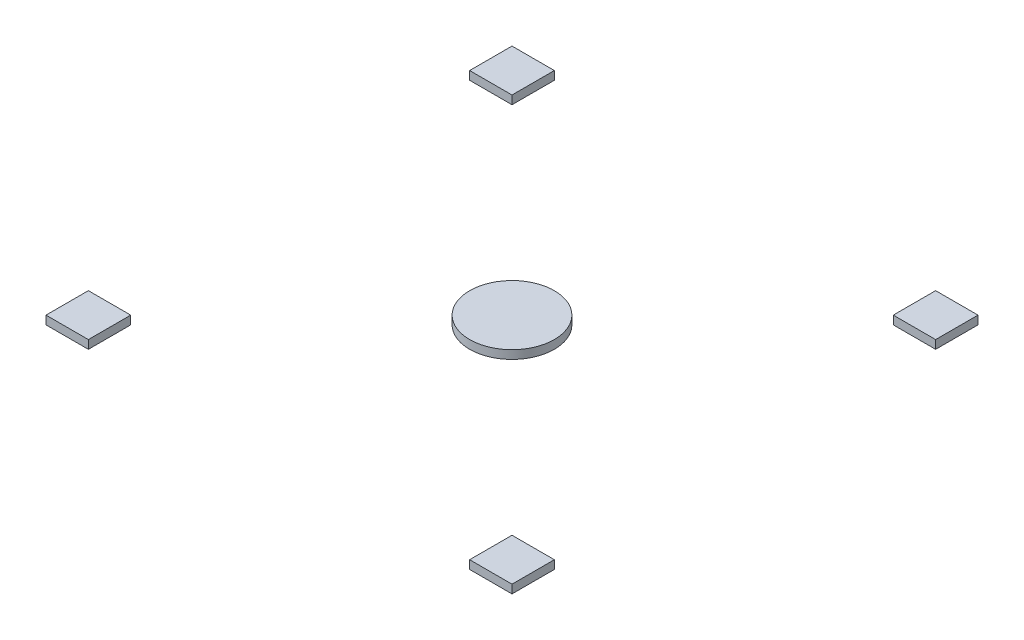
ISO-10303-21;
HEADER;
FILE_DESCRIPTION(('STEP AP214'),'2;1');
FILE_NAME('part.step','',(''),(''),'','','');
FILE_SCHEMA(('AUTOMOTIVE_DESIGN { 1 0 10303 214 1 1 1 1 }'));
ENDSEC;
DATA;
#1=APPLICATION_CONTEXT('core data for automotive mechanical design processes');
#2=APPLICATION_PROTOCOL_DEFINITION('international standard','automotive_design',2000,#1);
#3=PRODUCT_CONTEXT('',#1,'mechanical');
#4=PRODUCT('Part','Part','',(#3));
#5=PRODUCT_RELATED_PRODUCT_CATEGORY('part','',(#4));
#6=PRODUCT_DEFINITION_FORMATION('','',#4);
#7=PRODUCT_DEFINITION_CONTEXT('part definition',#1,'design');
#8=PRODUCT_DEFINITION('design','',#6,#7);
#9=PRODUCT_DEFINITION_SHAPE('','',#8);
#10=(LENGTH_UNIT() NAMED_UNIT(*) SI_UNIT(.MILLI.,.METRE.));
#11=(NAMED_UNIT(*) PLANE_ANGLE_UNIT() SI_UNIT($,.RADIAN.));
#12=(NAMED_UNIT(*) SI_UNIT($,.STERADIAN.) SOLID_ANGLE_UNIT());
#13=UNCERTAINTY_MEASURE_WITH_UNIT(LENGTH_MEASURE(1.E-05),#10,'distance_accuracy_value','');
#14=(GEOMETRIC_REPRESENTATION_CONTEXT(3) GLOBAL_UNCERTAINTY_ASSIGNED_CONTEXT((#13)) GLOBAL_UNIT_ASSIGNED_CONTEXT((#10,
#11,#12)) REPRESENTATION_CONTEXT('',''));
#15=CARTESIAN_POINT('',(0.,0.,0.));
#16=DIRECTION('',(0.,0.,1.));
#17=DIRECTION('',(1.,0.,0.));
#18=AXIS2_PLACEMENT_3D('',#15,#16,#17);
#19=CARTESIAN_POINT('',(-54.9999999999999,2.,55.));
#20=DIRECTION('',(0.,0.,-1.));
#21=DIRECTION('',(-1.,0.,0.));
#22=AXIS2_PLACEMENT_3D('',#19,#20,#21);
#23=PLANE('',#22);
#24=DIRECTION('',(1.,0.,0.));
#25=VECTOR('',#24,1.);
#26=CARTESIAN_POINT('',(-54.9999999999999,0.,55.));
#27=LINE('',#26,#25);
#28=CARTESIAN_POINT('',(-54.9999999999999,0.,55.));
#29=VERTEX_POINT('',#28);
#30=CARTESIAN_POINT('',(-44.9999999999999,0.,55.));
#31=VERTEX_POINT('',#30);
#32=EDGE_CURVE('E113',#29,#31,#27,.T.);
#33=ORIENTED_EDGE('',*,*,#32,.T.);
#34=DIRECTION('',(0.,-1.,0.));
#35=VECTOR('',#34,1.);
#36=CARTESIAN_POINT('',(-44.9999999999999,2.,55.));
#37=LINE('',#36,#35);
#38=CARTESIAN_POINT('',(-44.9999999999999,2.,55.));
#39=VERTEX_POINT('',#38);
#40=EDGE_CURVE('E12',#39,#31,#37,.T.);
#41=ORIENTED_EDGE('',*,*,#40,.F.);
#42=DIRECTION('',(1.,0.,0.));
#43=VECTOR('',#42,1.);
#44=CARTESIAN_POINT('',(-54.9999999999999,2.,55.));
#45=LINE('',#44,#43);
#46=CARTESIAN_POINT('',(-54.9999999999999,2.,55.));
#47=VERTEX_POINT('',#46);
#48=EDGE_CURVE('E101',#47,#39,#45,.T.);
#49=ORIENTED_EDGE('',*,*,#48,.F.);
#50=DIRECTION('',(0.,-1.,0.));
#51=VECTOR('',#50,1.);
#52=CARTESIAN_POINT('',(-54.9999999999999,2.,55.));
#53=LINE('',#52,#51);
#54=EDGE_CURVE('E109',#47,#29,#53,.T.);
#55=ORIENTED_EDGE('',*,*,#54,.T.);
#56=EDGE_LOOP('',(#33,#41,#49,#55));
#57=FACE_BOUND('',#56,.T.);
#58=ADVANCED_FACE('F50',(#57),#23,.F.);
#59=CARTESIAN_POINT('',(-44.9999999999999,2.,44.9999999999999));
#60=DIRECTION('',(-1.,0.,0.));
#61=DIRECTION('',(0.,0.,1.));
#62=AXIS2_PLACEMENT_3D('',#59,#60,#61);
#63=PLANE('',#62);
#64=DIRECTION('',(0.,0.,-1.));
#65=VECTOR('',#64,1.);
#66=CARTESIAN_POINT('',(-44.9999999999999,0.,44.9999999999999));
#67=LINE('',#66,#65);
#68=CARTESIAN_POINT('',(-44.9999999999999,0.,44.9999999999999));
#69=VERTEX_POINT('',#68);
#70=EDGE_CURVE('E105',#31,#69,#67,.T.);
#71=ORIENTED_EDGE('',*,*,#70,.T.);
#72=DIRECTION('',(0.,-1.,0.));
#73=VECTOR('',#72,1.);
#74=CARTESIAN_POINT('',(-44.9999999999999,2.,44.9999999999999));
#75=LINE('',#74,#73);
#76=CARTESIAN_POINT('',(-44.9999999999999,2.,44.9999999999999));
#77=VERTEX_POINT('',#76);
#78=EDGE_CURVE('E58',#77,#69,#75,.T.);
#79=ORIENTED_EDGE('',*,*,#78,.F.);
#80=DIRECTION('',(0.,0.,-1.));
#81=VECTOR('',#80,1.);
#82=CARTESIAN_POINT('',(-44.9999999999999,2.,44.9999999999999));
#83=LINE('',#82,#81);
#84=EDGE_CURVE('E96',#39,#77,#83,.T.);
#85=ORIENTED_EDGE('',*,*,#84,.F.);
#86=ORIENTED_EDGE('',*,*,#40,.T.);
#87=EDGE_LOOP('',(#71,#79,#85,#86));
#88=FACE_BOUND('',#87,.T.);
#89=ADVANCED_FACE('F104',(#88),#63,.F.);
#90=CARTESIAN_POINT('',(-54.9999999999999,2.,45.));
#91=DIRECTION('',(0.,0.,1.));
#92=DIRECTION('',(1.,0.,0.));
#93=AXIS2_PLACEMENT_3D('',#90,#91,#92);
#94=PLANE('',#93);
#95=DIRECTION('',(-1.,0.,0.));
#96=VECTOR('',#95,1.);
#97=CARTESIAN_POINT('',(-54.9999999999999,0.,45.));
#98=LINE('',#97,#96);
#99=CARTESIAN_POINT('',(-54.9999999999999,0.,45.));
#100=VERTEX_POINT('',#99);
#101=EDGE_CURVE('E83',#69,#100,#98,.T.);
#102=ORIENTED_EDGE('',*,*,#101,.T.);
#103=DIRECTION('',(0.,-1.,0.));
#104=VECTOR('',#103,1.);
#105=CARTESIAN_POINT('',(-54.9999999999999,2.,45.));
#106=LINE('',#105,#104);
#107=CARTESIAN_POINT('',(-54.9999999999999,2.,45.));
#108=VERTEX_POINT('',#107);
#109=EDGE_CURVE('E106',#108,#100,#106,.T.);
#110=ORIENTED_EDGE('',*,*,#109,.F.);
#111=DIRECTION('',(-1.,0.,0.));
#112=VECTOR('',#111,1.);
#113=CARTESIAN_POINT('',(-54.9999999999999,2.,45.));
#114=LINE('',#113,#112);
#115=EDGE_CURVE('E99',#77,#108,#114,.T.);
#116=ORIENTED_EDGE('',*,*,#115,.F.);
#117=ORIENTED_EDGE('',*,*,#78,.T.);
#118=EDGE_LOOP('',(#102,#110,#116,#117));
#119=FACE_BOUND('',#118,.T.);
#120=ADVANCED_FACE('F107',(#119),#94,.F.);
#121=CARTESIAN_POINT('',(-54.9999999999999,2.,45.));
#122=DIRECTION('',(1.,0.,0.));
#123=DIRECTION('',(0.,0.,-1.));
#124=AXIS2_PLACEMENT_3D('',#121,#122,#123);
#125=PLANE('',#124);
#126=DIRECTION('',(0.,0.,1.));
#127=VECTOR('',#126,1.);
#128=CARTESIAN_POINT('',(-54.9999999999999,0.,45.));
#129=LINE('',#128,#127);
#130=EDGE_CURVE('E89',#100,#29,#129,.T.);
#131=ORIENTED_EDGE('',*,*,#130,.T.);
#132=ORIENTED_EDGE('',*,*,#54,.F.);
#133=DIRECTION('',(0.,0.,1.));
#134=VECTOR('',#133,1.);
#135=CARTESIAN_POINT('',(-54.9999999999999,2.,45.));
#136=LINE('',#135,#134);
#137=EDGE_CURVE('E66',#108,#47,#136,.T.);
#138=ORIENTED_EDGE('',*,*,#137,.F.);
#139=ORIENTED_EDGE('',*,*,#109,.T.);
#140=EDGE_LOOP('',(#131,#132,#138,#139));
#141=FACE_BOUND('',#140,.T.);
#142=ADVANCED_FACE('F120',(#141),#125,.F.);
#143=CARTESIAN_POINT('',(0.,2.,0.));
#144=DIRECTION('',(0.,-1.,0.));
#145=DIRECTION('',(0.,0.,-1.));
#146=AXIS2_PLACEMENT_3D('',#143,#144,#145);
#147=PLANE('',#146);
#148=ORIENTED_EDGE('',*,*,#48,.T.);
#149=ORIENTED_EDGE('',*,*,#84,.T.);
#150=ORIENTED_EDGE('',*,*,#115,.T.);
#151=ORIENTED_EDGE('',*,*,#137,.T.);
#152=EDGE_LOOP('',(#148,#149,#150,#151));
#153=FACE_BOUND('',#152,.T.);
#154=ADVANCED_FACE('F97',(#153),#147,.F.);
#155=CARTESIAN_POINT('',(0.,0.,0.));
#156=DIRECTION('',(0.,-1.,0.));
#157=DIRECTION('',(0.,0.,-1.));
#158=AXIS2_PLACEMENT_3D('',#155,#156,#157);
#159=PLANE('',#158);
#160=ORIENTED_EDGE('',*,*,#32,.F.);
#161=ORIENTED_EDGE('',*,*,#130,.F.);
#162=ORIENTED_EDGE('',*,*,#101,.F.);
#163=ORIENTED_EDGE('',*,*,#70,.F.);
#164=EDGE_LOOP('',(#160,#161,#162,#163));
#165=FACE_BOUND('',#164,.T.);
#166=ADVANCED_FACE('F123',(#165),#159,.T.);
#167=CLOSED_SHELL('',(#58,#89,#120,#142,#154,#166));
#168=MANIFOLD_SOLID_BREP('B2',#167);
#169=CARTESIAN_POINT('',(55.,2.,54.9999999999999));
#170=DIRECTION('',(-1.,0.,0.));
#171=DIRECTION('',(0.,0.,1.));
#172=AXIS2_PLACEMENT_3D('',#169,#170,#171);
#173=PLANE('',#172);
#174=DIRECTION('',(0.,0.,-1.));
#175=VECTOR('',#174,1.);
#176=CARTESIAN_POINT('',(55.,0.,54.9999999999999));
#177=LINE('',#176,#175);
#178=CARTESIAN_POINT('',(55.,0.,54.9999999999999));
#179=VERTEX_POINT('',#178);
#180=CARTESIAN_POINT('',(55.,0.,44.9999999999999));
#181=VERTEX_POINT('',#180);
#182=EDGE_CURVE('E247',#179,#181,#177,.T.);
#183=ORIENTED_EDGE('',*,*,#182,.T.);
#184=DIRECTION('',(0.,-1.,0.));
#185=VECTOR('',#184,1.);
#186=CARTESIAN_POINT('',(55.,2.,44.9999999999999));
#187=LINE('',#186,#185);
#188=CARTESIAN_POINT('',(55.,2.,44.9999999999999));
#189=VERTEX_POINT('',#188);
#190=EDGE_CURVE('E48',#189,#181,#187,.T.);
#191=ORIENTED_EDGE('',*,*,#190,.F.);
#192=DIRECTION('',(0.,0.,-1.));
#193=VECTOR('',#192,1.);
#194=CARTESIAN_POINT('',(55.,2.,54.9999999999999));
#195=LINE('',#194,#193);
#196=CARTESIAN_POINT('',(55.,2.,54.9999999999999));
#197=VERTEX_POINT('',#196);
#198=EDGE_CURVE('E235',#197,#189,#195,.T.);
#199=ORIENTED_EDGE('',*,*,#198,.F.);
#200=DIRECTION('',(0.,-1.,0.));
#201=VECTOR('',#200,1.);
#202=CARTESIAN_POINT('',(55.,2.,54.9999999999999));
#203=LINE('',#202,#201);
#204=EDGE_CURVE('E243',#197,#179,#203,.T.);
#205=ORIENTED_EDGE('',*,*,#204,.T.);
#206=EDGE_LOOP('',(#183,#191,#199,#205));
#207=FACE_BOUND('',#206,.T.);
#208=ADVANCED_FACE('F184',(#207),#173,.F.);
#209=CARTESIAN_POINT('',(44.9999999999999,2.,44.9999999999999));
#210=DIRECTION('',(0.,0.,1.));
#211=DIRECTION('',(1.,0.,0.));
#212=AXIS2_PLACEMENT_3D('',#209,#210,#211);
#213=PLANE('',#212);
#214=DIRECTION('',(-1.,0.,0.));
#215=VECTOR('',#214,1.);
#216=CARTESIAN_POINT('',(44.9999999999999,0.,44.9999999999999));
#217=LINE('',#216,#215);
#218=CARTESIAN_POINT('',(44.9999999999999,0.,44.9999999999999));
#219=VERTEX_POINT('',#218);
#220=EDGE_CURVE('E239',#181,#219,#217,.T.);
#221=ORIENTED_EDGE('',*,*,#220,.T.);
#222=DIRECTION('',(0.,-1.,0.));
#223=VECTOR('',#222,1.);
#224=CARTESIAN_POINT('',(44.9999999999999,2.,44.9999999999999));
#225=LINE('',#224,#223);
#226=CARTESIAN_POINT('',(44.9999999999999,2.,44.9999999999999));
#227=VERTEX_POINT('',#226);
#228=EDGE_CURVE('E192',#227,#219,#225,.T.);
#229=ORIENTED_EDGE('',*,*,#228,.F.);
#230=DIRECTION('',(-1.,0.,0.));
#231=VECTOR('',#230,1.);
#232=CARTESIAN_POINT('',(44.9999999999999,2.,44.9999999999999));
#233=LINE('',#232,#231);
#234=EDGE_CURVE('E230',#189,#227,#233,.T.);
#235=ORIENTED_EDGE('',*,*,#234,.F.);
#236=ORIENTED_EDGE('',*,*,#190,.T.);
#237=EDGE_LOOP('',(#221,#229,#235,#236));
#238=FACE_BOUND('',#237,.T.);
#239=ADVANCED_FACE('F238',(#238),#213,.F.);
#240=CARTESIAN_POINT('',(45.,2.,54.9999999999999));
#241=DIRECTION('',(1.,0.,0.));
#242=DIRECTION('',(0.,0.,-1.));
#243=AXIS2_PLACEMENT_3D('',#240,#241,#242);
#244=PLANE('',#243);
#245=DIRECTION('',(0.,0.,1.));
#246=VECTOR('',#245,1.);
#247=CARTESIAN_POINT('',(45.,0.,54.9999999999999));
#248=LINE('',#247,#246);
#249=CARTESIAN_POINT('',(45.,0.,54.9999999999999));
#250=VERTEX_POINT('',#249);
#251=EDGE_CURVE('E217',#219,#250,#248,.T.);
#252=ORIENTED_EDGE('',*,*,#251,.T.);
#253=DIRECTION('',(0.,-1.,0.));
#254=VECTOR('',#253,1.);
#255=CARTESIAN_POINT('',(45.,2.,54.9999999999999));
#256=LINE('',#255,#254);
#257=CARTESIAN_POINT('',(45.,2.,54.9999999999999));
#258=VERTEX_POINT('',#257);
#259=EDGE_CURVE('E240',#258,#250,#256,.T.);
#260=ORIENTED_EDGE('',*,*,#259,.F.);
#261=DIRECTION('',(0.,0.,1.));
#262=VECTOR('',#261,1.);
#263=CARTESIAN_POINT('',(45.,2.,54.9999999999999));
#264=LINE('',#263,#262);
#265=EDGE_CURVE('E233',#227,#258,#264,.T.);
#266=ORIENTED_EDGE('',*,*,#265,.F.);
#267=ORIENTED_EDGE('',*,*,#228,.T.);
#268=EDGE_LOOP('',(#252,#260,#266,#267));
#269=FACE_BOUND('',#268,.T.);
#270=ADVANCED_FACE('F241',(#269),#244,.F.);
#271=CARTESIAN_POINT('',(45.,2.,54.9999999999999));
#272=DIRECTION('',(0.,0.,-1.));
#273=DIRECTION('',(-1.,0.,0.));
#274=AXIS2_PLACEMENT_3D('',#271,#272,#273);
#275=PLANE('',#274);
#276=DIRECTION('',(1.,0.,0.));
#277=VECTOR('',#276,1.);
#278=CARTESIAN_POINT('',(45.,0.,54.9999999999999));
#279=LINE('',#278,#277);
#280=EDGE_CURVE('E223',#250,#179,#279,.T.);
#281=ORIENTED_EDGE('',*,*,#280,.T.);
#282=ORIENTED_EDGE('',*,*,#204,.F.);
#283=DIRECTION('',(1.,0.,0.));
#284=VECTOR('',#283,1.);
#285=CARTESIAN_POINT('',(45.,2.,54.9999999999999));
#286=LINE('',#285,#284);
#287=EDGE_CURVE('E200',#258,#197,#286,.T.);
#288=ORIENTED_EDGE('',*,*,#287,.F.);
#289=ORIENTED_EDGE('',*,*,#259,.T.);
#290=EDGE_LOOP('',(#281,#282,#288,#289));
#291=FACE_BOUND('',#290,.T.);
#292=ADVANCED_FACE('F254',(#291),#275,.F.);
#293=CARTESIAN_POINT('',(0.,2.,0.));
#294=DIRECTION('',(0.,-1.,0.));
#295=DIRECTION('',(0.,0.,-1.));
#296=AXIS2_PLACEMENT_3D('',#293,#294,#295);
#297=PLANE('',#296);
#298=ORIENTED_EDGE('',*,*,#198,.T.);
#299=ORIENTED_EDGE('',*,*,#234,.T.);
#300=ORIENTED_EDGE('',*,*,#265,.T.);
#301=ORIENTED_EDGE('',*,*,#287,.T.);
#302=EDGE_LOOP('',(#298,#299,#300,#301));
#303=FACE_BOUND('',#302,.T.);
#304=ADVANCED_FACE('F231',(#303),#297,.F.);
#305=CARTESIAN_POINT('',(0.,0.,0.));
#306=DIRECTION('',(0.,-1.,0.));
#307=DIRECTION('',(0.,0.,-1.));
#308=AXIS2_PLACEMENT_3D('',#305,#306,#307);
#309=PLANE('',#308);
#310=ORIENTED_EDGE('',*,*,#182,.F.);
#311=ORIENTED_EDGE('',*,*,#280,.F.);
#312=ORIENTED_EDGE('',*,*,#251,.F.);
#313=ORIENTED_EDGE('',*,*,#220,.F.);
#314=EDGE_LOOP('',(#310,#311,#312,#313));
#315=FACE_BOUND('',#314,.T.);
#316=ADVANCED_FACE('F257',(#315),#309,.T.);
#317=CLOSED_SHELL('',(#208,#239,#270,#292,#304,#316));
#318=MANIFOLD_SOLID_BREP('B6',#317);
#319=CARTESIAN_POINT('',(55.,2.,-55.));
#320=DIRECTION('',(0.,0.,1.));
#321=DIRECTION('',(1.,0.,0.));
#322=AXIS2_PLACEMENT_3D('',#319,#320,#321);
#323=PLANE('',#322);
#324=DIRECTION('',(-1.,0.,0.));
#325=VECTOR('',#324,1.);
#326=CARTESIAN_POINT('',(55.,0.,-55.));
#327=LINE('',#326,#325);
#328=CARTESIAN_POINT('',(55.,0.,-55.));
#329=VERTEX_POINT('',#328);
#330=CARTESIAN_POINT('',(45.,0.,-55.));
#331=VERTEX_POINT('',#330);
#332=EDGE_CURVE('E379',#329,#331,#327,.T.);
#333=ORIENTED_EDGE('',*,*,#332,.T.);
#334=DIRECTION('',(0.,-1.,0.));
#335=VECTOR('',#334,1.);
#336=CARTESIAN_POINT('',(45.,2.,-55.));
#337=LINE('',#336,#335);
#338=CARTESIAN_POINT('',(45.,2.,-55.));
#339=VERTEX_POINT('',#338);
#340=EDGE_CURVE('E182',#339,#331,#337,.T.);
#341=ORIENTED_EDGE('',*,*,#340,.F.);
#342=DIRECTION('',(-1.,0.,0.));
#343=VECTOR('',#342,1.);
#344=CARTESIAN_POINT('',(55.,2.,-55.));
#345=LINE('',#344,#343);
#346=CARTESIAN_POINT('',(55.,2.,-55.));
#347=VERTEX_POINT('',#346);
#348=EDGE_CURVE('E367',#347,#339,#345,.T.);
#349=ORIENTED_EDGE('',*,*,#348,.F.);
#350=DIRECTION('',(0.,-1.,0.));
#351=VECTOR('',#350,1.);
#352=CARTESIAN_POINT('',(55.,2.,-55.));
#353=LINE('',#352,#351);
#354=EDGE_CURVE('E375',#347,#329,#353,.T.);
#355=ORIENTED_EDGE('',*,*,#354,.T.);
#356=EDGE_LOOP('',(#333,#341,#349,#355));
#357=FACE_BOUND('',#356,.T.);
#358=ADVANCED_FACE('F316',(#357),#323,.F.);
#359=CARTESIAN_POINT('',(45.,2.,-44.9999999999999));
#360=DIRECTION('',(1.,0.,0.));
#361=DIRECTION('',(0.,0.,-1.));
#362=AXIS2_PLACEMENT_3D('',#359,#360,#361);
#363=PLANE('',#362);
#364=DIRECTION('',(0.,0.,1.));
#365=VECTOR('',#364,1.);
#366=CARTESIAN_POINT('',(45.,0.,-44.9999999999999));
#367=LINE('',#366,#365);
#368=CARTESIAN_POINT('',(45.,0.,-44.9999999999999));
#369=VERTEX_POINT('',#368);
#370=EDGE_CURVE('E371',#331,#369,#367,.T.);
#371=ORIENTED_EDGE('',*,*,#370,.T.);
#372=DIRECTION('',(0.,-1.,0.));
#373=VECTOR('',#372,1.);
#374=CARTESIAN_POINT('',(45.,2.,-44.9999999999999));
#375=LINE('',#374,#373);
#376=CARTESIAN_POINT('',(45.,2.,-44.9999999999999));
#377=VERTEX_POINT('',#376);
#378=EDGE_CURVE('E324',#377,#369,#375,.T.);
#379=ORIENTED_EDGE('',*,*,#378,.F.);
#380=DIRECTION('',(0.,0.,1.));
#381=VECTOR('',#380,1.);
#382=CARTESIAN_POINT('',(45.,2.,-44.9999999999999));
#383=LINE('',#382,#381);
#384=EDGE_CURVE('E362',#339,#377,#383,.T.);
#385=ORIENTED_EDGE('',*,*,#384,.F.);
#386=ORIENTED_EDGE('',*,*,#340,.T.);
#387=EDGE_LOOP('',(#371,#379,#385,#386));
#388=FACE_BOUND('',#387,.T.);
#389=ADVANCED_FACE('F370',(#388),#363,.F.);
#390=CARTESIAN_POINT('',(55.,2.,-45.));
#391=DIRECTION('',(0.,0.,-1.));
#392=DIRECTION('',(-1.,0.,0.));
#393=AXIS2_PLACEMENT_3D('',#390,#391,#392);
#394=PLANE('',#393);
#395=DIRECTION('',(1.,0.,0.));
#396=VECTOR('',#395,1.);
#397=CARTESIAN_POINT('',(55.,0.,-45.));
#398=LINE('',#397,#396);
#399=CARTESIAN_POINT('',(55.,0.,-45.));
#400=VERTEX_POINT('',#399);
#401=EDGE_CURVE('E349',#369,#400,#398,.T.);
#402=ORIENTED_EDGE('',*,*,#401,.T.);
#403=DIRECTION('',(0.,-1.,0.));
#404=VECTOR('',#403,1.);
#405=CARTESIAN_POINT('',(55.,2.,-45.));
#406=LINE('',#405,#404);
#407=CARTESIAN_POINT('',(55.,2.,-45.));
#408=VERTEX_POINT('',#407);
#409=EDGE_CURVE('E372',#408,#400,#406,.T.);
#410=ORIENTED_EDGE('',*,*,#409,.F.);
#411=DIRECTION('',(1.,0.,0.));
#412=VECTOR('',#411,1.);
#413=CARTESIAN_POINT('',(55.,2.,-45.));
#414=LINE('',#413,#412);
#415=EDGE_CURVE('E365',#377,#408,#414,.T.);
#416=ORIENTED_EDGE('',*,*,#415,.F.);
#417=ORIENTED_EDGE('',*,*,#378,.T.);
#418=EDGE_LOOP('',(#402,#410,#416,#417));
#419=FACE_BOUND('',#418,.T.);
#420=ADVANCED_FACE('F373',(#419),#394,.F.);
#421=CARTESIAN_POINT('',(55.,2.,-45.));
#422=DIRECTION('',(-1.,0.,0.));
#423=DIRECTION('',(0.,0.,1.));
#424=AXIS2_PLACEMENT_3D('',#421,#422,#423);
#425=PLANE('',#424);
#426=DIRECTION('',(0.,0.,-1.));
#427=VECTOR('',#426,1.);
#428=CARTESIAN_POINT('',(55.,0.,-45.));
#429=LINE('',#428,#427);
#430=EDGE_CURVE('E355',#400,#329,#429,.T.);
#431=ORIENTED_EDGE('',*,*,#430,.T.);
#432=ORIENTED_EDGE('',*,*,#354,.F.);
#433=DIRECTION('',(0.,0.,-1.));
#434=VECTOR('',#433,1.);
#435=CARTESIAN_POINT('',(55.,2.,-45.));
#436=LINE('',#435,#434);
#437=EDGE_CURVE('E332',#408,#347,#436,.T.);
#438=ORIENTED_EDGE('',*,*,#437,.F.);
#439=ORIENTED_EDGE('',*,*,#409,.T.);
#440=EDGE_LOOP('',(#431,#432,#438,#439));
#441=FACE_BOUND('',#440,.T.);
#442=ADVANCED_FACE('F386',(#441),#425,.F.);
#443=CARTESIAN_POINT('',(0.,2.,0.));
#444=DIRECTION('',(0.,-1.,0.));
#445=DIRECTION('',(0.,0.,-1.));
#446=AXIS2_PLACEMENT_3D('',#443,#444,#445);
#447=PLANE('',#446);
#448=ORIENTED_EDGE('',*,*,#348,.T.);
#449=ORIENTED_EDGE('',*,*,#384,.T.);
#450=ORIENTED_EDGE('',*,*,#415,.T.);
#451=ORIENTED_EDGE('',*,*,#437,.T.);
#452=EDGE_LOOP('',(#448,#449,#450,#451));
#453=FACE_BOUND('',#452,.T.);
#454=ADVANCED_FACE('F363',(#453),#447,.F.);
#455=CARTESIAN_POINT('',(0.,0.,0.));
#456=DIRECTION('',(0.,-1.,0.));
#457=DIRECTION('',(0.,0.,-1.));
#458=AXIS2_PLACEMENT_3D('',#455,#456,#457);
#459=PLANE('',#458);
#460=ORIENTED_EDGE('',*,*,#332,.F.);
#461=ORIENTED_EDGE('',*,*,#430,.F.);
#462=ORIENTED_EDGE('',*,*,#401,.F.);
#463=ORIENTED_EDGE('',*,*,#370,.F.);
#464=EDGE_LOOP('',(#460,#461,#462,#463));
#465=FACE_BOUND('',#464,.T.);
#466=ADVANCED_FACE('F389',(#465),#459,.T.);
#467=CLOSED_SHELL('',(#358,#389,#420,#442,#454,#466));
#468=MANIFOLD_SOLID_BREP('B42',#467);
#469=CARTESIAN_POINT('',(0.,2.,0.));
#470=DIRECTION('',(0.,-1.,0.));
#471=DIRECTION('',(0.,0.,-1.));
#472=AXIS2_PLACEMENT_3D('',#469,#470,#471);
#473=CYLINDRICAL_SURFACE('',#472,10.);
#474=CARTESIAN_POINT('',(0.,2.,0.));
#475=DIRECTION('',(0.,1.,0.));
#476=DIRECTION('',(0.,0.,1.));
#477=AXIS2_PLACEMENT_3D('',#474,#475,#476);
#478=CIRCLE('',#477,10.);
#479=CARTESIAN_POINT('',(0.,2.,10.));
#480=VERTEX_POINT('',#479);
#481=EDGE_CURVE('E315',#480,#480,#478,.T.);
#482=ORIENTED_EDGE('',*,*,#481,.F.);
#483=EDGE_LOOP('',(#482));
#484=FACE_BOUND('',#483,.T.);
#485=CARTESIAN_POINT('',(0.,0.,0.));
#486=DIRECTION('',(0.,1.,0.));
#487=DIRECTION('',(0.,0.,1.));
#488=AXIS2_PLACEMENT_3D('',#485,#486,#487);
#489=CIRCLE('',#488,10.);
#490=CARTESIAN_POINT('',(0.,0.,10.));
#491=VERTEX_POINT('',#490);
#492=EDGE_CURVE('E452',#491,#491,#489,.T.);
#493=ORIENTED_EDGE('',*,*,#492,.T.);
#494=EDGE_LOOP('',(#493));
#495=FACE_BOUND('',#494,.T.);
#496=ADVANCED_FACE('F449',(#484,#495),#473,.T.);
#497=CARTESIAN_POINT('',(0.,2.,0.));
#498=DIRECTION('',(0.,1.,0.));
#499=DIRECTION('',(0.,0.,1.));
#500=AXIS2_PLACEMENT_3D('',#497,#498,#499);
#501=PLANE('',#500);
#502=ORIENTED_EDGE('',*,*,#481,.T.);
#503=EDGE_LOOP('',(#502));
#504=FACE_BOUND('',#503,.T.);
#505=ADVANCED_FACE('F466',(#504),#501,.T.);
#506=CARTESIAN_POINT('',(0.,0.,0.));
#507=DIRECTION('',(0.,1.,0.));
#508=DIRECTION('',(0.,0.,1.));
#509=AXIS2_PLACEMENT_3D('',#506,#507,#508);
#510=PLANE('',#509);
#511=ORIENTED_EDGE('',*,*,#492,.F.);
#512=EDGE_LOOP('',(#511));
#513=FACE_BOUND('',#512,.T.);
#514=ADVANCED_FACE('F464',(#513),#510,.F.);
#515=CLOSED_SHELL('',(#496,#505,#514));
#516=MANIFOLD_SOLID_BREP('B176',#515);
#517=CARTESIAN_POINT('',(-55.,2.,-55.));
#518=DIRECTION('',(1.,0.,0.));
#519=DIRECTION('',(0.,0.,-1.));
#520=AXIS2_PLACEMENT_3D('',#517,#518,#519);
#521=PLANE('',#520);
#522=DIRECTION('',(0.,0.,1.));
#523=VECTOR('',#522,1.);
#524=CARTESIAN_POINT('',(-55.,0.,-55.));
#525=LINE('',#524,#523);
#526=CARTESIAN_POINT('',(-55.,0.,-55.));
#527=VERTEX_POINT('',#526);
#528=CARTESIAN_POINT('',(-55.,0.,-45.));
#529=VERTEX_POINT('',#528);
#530=EDGE_CURVE('E555',#527,#529,#525,.T.);
#531=ORIENTED_EDGE('',*,*,#530,.T.);
#532=DIRECTION('',(0.,-1.,0.));
#533=VECTOR('',#532,1.);
#534=CARTESIAN_POINT('',(-55.,2.,-45.));
#535=LINE('',#534,#533);
#536=CARTESIAN_POINT('',(-55.,2.,-45.));
#537=VERTEX_POINT('',#536);
#538=EDGE_CURVE('E447',#537,#529,#535,.T.);
#539=ORIENTED_EDGE('',*,*,#538,.F.);
#540=DIRECTION('',(0.,0.,1.));
#541=VECTOR('',#540,1.);
#542=CARTESIAN_POINT('',(-55.,2.,-55.));
#543=LINE('',#542,#541);
#544=CARTESIAN_POINT('',(-55.,2.,-55.));
#545=VERTEX_POINT('',#544);
#546=EDGE_CURVE('E543',#545,#537,#543,.T.);
#547=ORIENTED_EDGE('',*,*,#546,.F.);
#548=DIRECTION('',(0.,-1.,0.));
#549=VECTOR('',#548,1.);
#550=CARTESIAN_POINT('',(-55.,2.,-55.));
#551=LINE('',#550,#549);
#552=EDGE_CURVE('E551',#545,#527,#551,.T.);
#553=ORIENTED_EDGE('',*,*,#552,.T.);
#554=EDGE_LOOP('',(#531,#539,#547,#553));
#555=FACE_BOUND('',#554,.T.);
#556=ADVANCED_FACE('F492',(#555),#521,.F.);
#557=CARTESIAN_POINT('',(-44.9999999999999,2.,-45.));
#558=DIRECTION('',(0.,0.,-1.));
#559=DIRECTION('',(-1.,0.,0.));
#560=AXIS2_PLACEMENT_3D('',#557,#558,#559);
#561=PLANE('',#560);
#562=DIRECTION('',(1.,0.,0.));
#563=VECTOR('',#562,1.);
#564=CARTESIAN_POINT('',(-44.9999999999999,0.,-45.));
#565=LINE('',#564,#563);
#566=CARTESIAN_POINT('',(-44.9999999999999,0.,-45.));
#567=VERTEX_POINT('',#566);
#568=EDGE_CURVE('E547',#529,#567,#565,.T.);
#569=ORIENTED_EDGE('',*,*,#568,.T.);
#570=DIRECTION('',(0.,-1.,0.));
#571=VECTOR('',#570,1.);
#572=CARTESIAN_POINT('',(-44.9999999999999,2.,-45.));
#573=LINE('',#572,#571);
#574=CARTESIAN_POINT('',(-44.9999999999999,2.,-45.));
#575=VERTEX_POINT('',#574);
#576=EDGE_CURVE('E500',#575,#567,#573,.T.);
#577=ORIENTED_EDGE('',*,*,#576,.F.);
#578=DIRECTION('',(1.,0.,0.));
#579=VECTOR('',#578,1.);
#580=CARTESIAN_POINT('',(-44.9999999999999,2.,-45.));
#581=LINE('',#580,#579);
#582=EDGE_CURVE('E538',#537,#575,#581,.T.);
#583=ORIENTED_EDGE('',*,*,#582,.F.);
#584=ORIENTED_EDGE('',*,*,#538,.T.);
#585=EDGE_LOOP('',(#569,#577,#583,#584));
#586=FACE_BOUND('',#585,.T.);
#587=ADVANCED_FACE('F546',(#586),#561,.F.);
#588=CARTESIAN_POINT('',(-45.,2.,-55.));
#589=DIRECTION('',(-1.,0.,0.));
#590=DIRECTION('',(0.,0.,1.));
#591=AXIS2_PLACEMENT_3D('',#588,#589,#590);
#592=PLANE('',#591);
#593=DIRECTION('',(0.,0.,-1.));
#594=VECTOR('',#593,1.);
#595=CARTESIAN_POINT('',(-45.,0.,-55.));
#596=LINE('',#595,#594);
#597=CARTESIAN_POINT('',(-45.,0.,-55.));
#598=VERTEX_POINT('',#597);
#599=EDGE_CURVE('E525',#567,#598,#596,.T.);
#600=ORIENTED_EDGE('',*,*,#599,.T.);
#601=DIRECTION('',(0.,-1.,0.));
#602=VECTOR('',#601,1.);
#603=CARTESIAN_POINT('',(-45.,2.,-55.));
#604=LINE('',#603,#602);
#605=CARTESIAN_POINT('',(-45.,2.,-55.));
#606=VERTEX_POINT('',#605);
#607=EDGE_CURVE('E548',#606,#598,#604,.T.);
#608=ORIENTED_EDGE('',*,*,#607,.F.);
#609=DIRECTION('',(0.,0.,-1.));
#610=VECTOR('',#609,1.);
#611=CARTESIAN_POINT('',(-45.,2.,-55.));
#612=LINE('',#611,#610);
#613=EDGE_CURVE('E541',#575,#606,#612,.T.);
#614=ORIENTED_EDGE('',*,*,#613,.F.);
#615=ORIENTED_EDGE('',*,*,#576,.T.);
#616=EDGE_LOOP('',(#600,#608,#614,#615));
#617=FACE_BOUND('',#616,.T.);
#618=ADVANCED_FACE('F549',(#617),#592,.F.);
#619=CARTESIAN_POINT('',(-45.,2.,-55.));
#620=DIRECTION('',(0.,0.,1.));
#621=DIRECTION('',(1.,0.,0.));
#622=AXIS2_PLACEMENT_3D('',#619,#620,#621);
#623=PLANE('',#622);
#624=DIRECTION('',(-1.,0.,0.));
#625=VECTOR('',#624,1.);
#626=CARTESIAN_POINT('',(-45.,0.,-55.));
#627=LINE('',#626,#625);
#628=EDGE_CURVE('E531',#598,#527,#627,.T.);
#629=ORIENTED_EDGE('',*,*,#628,.T.);
#630=ORIENTED_EDGE('',*,*,#552,.F.);
#631=DIRECTION('',(-1.,0.,0.));
#632=VECTOR('',#631,1.);
#633=CARTESIAN_POINT('',(-45.,2.,-55.));
#634=LINE('',#633,#632);
#635=EDGE_CURVE('E508',#606,#545,#634,.T.);
#636=ORIENTED_EDGE('',*,*,#635,.F.);
#637=ORIENTED_EDGE('',*,*,#607,.T.);
#638=EDGE_LOOP('',(#629,#630,#636,#637));
#639=FACE_BOUND('',#638,.T.);
#640=ADVANCED_FACE('F562',(#639),#623,.F.);
#641=CARTESIAN_POINT('',(0.,2.,0.));
#642=DIRECTION('',(0.,-1.,0.));
#643=DIRECTION('',(0.,0.,-1.));
#644=AXIS2_PLACEMENT_3D('',#641,#642,#643);
#645=PLANE('',#644);
#646=ORIENTED_EDGE('',*,*,#546,.T.);
#647=ORIENTED_EDGE('',*,*,#582,.T.);
#648=ORIENTED_EDGE('',*,*,#613,.T.);
#649=ORIENTED_EDGE('',*,*,#635,.T.);
#650=EDGE_LOOP('',(#646,#647,#648,#649));
#651=FACE_BOUND('',#650,.T.);
#652=ADVANCED_FACE('F539',(#651),#645,.F.);
#653=CARTESIAN_POINT('',(0.,0.,0.));
#654=DIRECTION('',(0.,-1.,0.));
#655=DIRECTION('',(0.,0.,-1.));
#656=AXIS2_PLACEMENT_3D('',#653,#654,#655);
#657=PLANE('',#656);
#658=ORIENTED_EDGE('',*,*,#530,.F.);
#659=ORIENTED_EDGE('',*,*,#628,.F.);
#660=ORIENTED_EDGE('',*,*,#599,.F.);
#661=ORIENTED_EDGE('',*,*,#568,.F.);
#662=EDGE_LOOP('',(#658,#659,#660,#661));
#663=FACE_BOUND('',#662,.T.);
#664=ADVANCED_FACE('F565',(#663),#657,.T.);
#665=CLOSED_SHELL('',(#556,#587,#618,#640,#652,#664));
#666=MANIFOLD_SOLID_BREP('B310',#665);
#667=ADVANCED_BREP_SHAPE_REPRESENTATION('',(#18,#168,#318,#468,#516,#666),#14);
#668=SHAPE_DEFINITION_REPRESENTATION(#9,#667);
ENDSEC;
END-ISO-10303-21;
